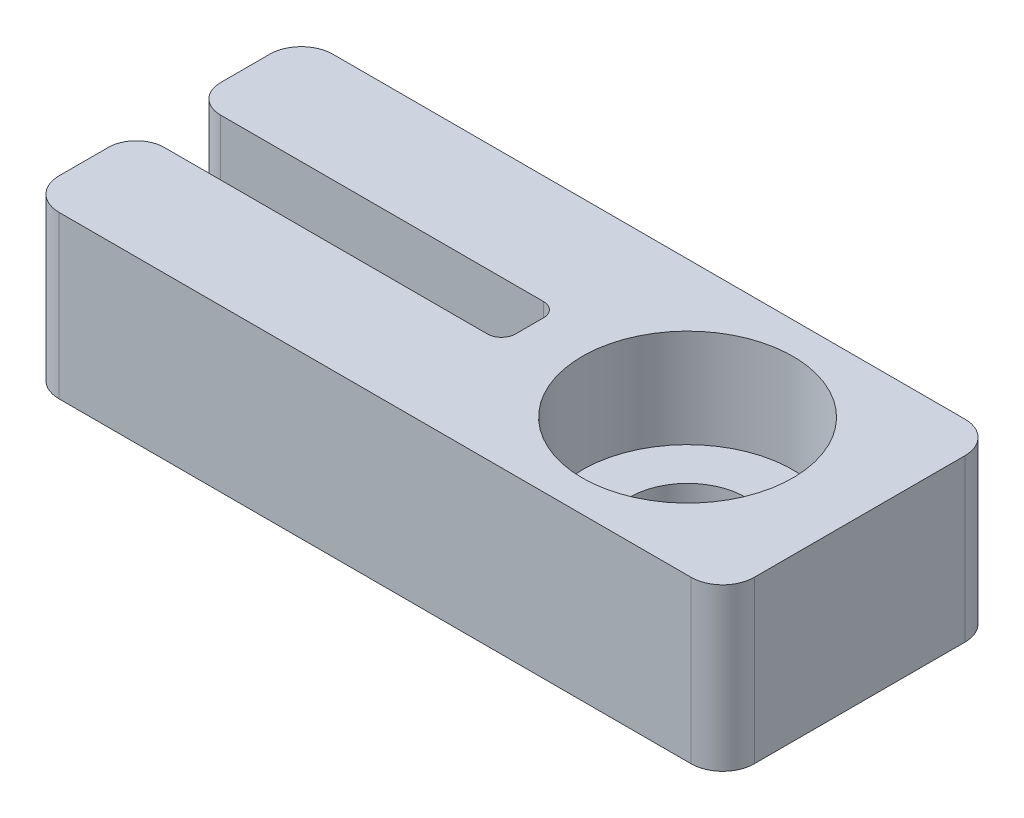
ISO-10303-21;
HEADER;
FILE_DESCRIPTION(('STEP AP214'),'2;1');
FILE_NAME('part.step','',(''),(''),'','','');
FILE_SCHEMA(('AUTOMOTIVE_DESIGN { 1 0 10303 214 1 1 1 1 }'));
ENDSEC;
DATA;
#1=APPLICATION_CONTEXT('core data for automotive mechanical design processes');
#2=APPLICATION_PROTOCOL_DEFINITION('international standard','automotive_design',2000,#1);
#3=PRODUCT_CONTEXT('',#1,'mechanical');
#4=PRODUCT('Part','Part','',(#3));
#5=PRODUCT_RELATED_PRODUCT_CATEGORY('part','',(#4));
#6=PRODUCT_DEFINITION_FORMATION('','',#4);
#7=PRODUCT_DEFINITION_CONTEXT('part definition',#1,'design');
#8=PRODUCT_DEFINITION('design','',#6,#7);
#9=PRODUCT_DEFINITION_SHAPE('','',#8);
#10=(LENGTH_UNIT() NAMED_UNIT(*) SI_UNIT(.MILLI.,.METRE.));
#11=(NAMED_UNIT(*) PLANE_ANGLE_UNIT() SI_UNIT($,.RADIAN.));
#12=(NAMED_UNIT(*) SI_UNIT($,.STERADIAN.) SOLID_ANGLE_UNIT());
#13=UNCERTAINTY_MEASURE_WITH_UNIT(LENGTH_MEASURE(1.E-05),#10,'distance_accuracy_value','');
#14=(GEOMETRIC_REPRESENTATION_CONTEXT(3) GLOBAL_UNCERTAINTY_ASSIGNED_CONTEXT((#13)) GLOBAL_UNIT_ASSIGNED_CONTEXT((#10,
#11,#12)) REPRESENTATION_CONTEXT('',''));
#15=CARTESIAN_POINT('',(0.,0.,0.));
#16=DIRECTION('',(0.,0.,1.));
#17=DIRECTION('',(1.,0.,0.));
#18=AXIS2_PLACEMENT_3D('',#15,#16,#17);
#19=CARTESIAN_POINT('',(5.,4.6,0.));
#20=DIRECTION('',(0.,-1.,0.));
#21=DIRECTION('',(0.,0.,-1.));
#22=AXIS2_PLACEMENT_3D('',#19,#20,#21);
#23=CYLINDRICAL_SURFACE('',#22,1.65);
#24=CARTESIAN_POINT('',(5.,0.,0.));
#25=DIRECTION('',(0.,1.,0.));
#26=DIRECTION('',(0.,0.,1.));
#27=AXIS2_PLACEMENT_3D('',#24,#25,#26);
#28=CIRCLE('',#27,1.65);
#29=CARTESIAN_POINT('',(5.,0.,1.65));
#30=VERTEX_POINT('',#29);
#31=EDGE_CURVE('E197',#30,#30,#28,.T.);
#32=ORIENTED_EDGE('',*,*,#31,.F.);
#33=EDGE_LOOP('',(#32));
#34=FACE_BOUND('',#33,.T.);
#35=CARTESIAN_POINT('',(5.,1.8,0.));
#36=DIRECTION('',(0.,1.,0.));
#37=DIRECTION('',(0.,0.,1.));
#38=AXIS2_PLACEMENT_3D('',#35,#36,#37);
#39=CIRCLE('',#38,1.65);
#40=CARTESIAN_POINT('',(5.,1.8,1.65));
#41=VERTEX_POINT('',#40);
#42=EDGE_CURVE('E43',#41,#41,#39,.T.);
#43=ORIENTED_EDGE('',*,*,#42,.T.);
#44=EDGE_LOOP('',(#43));
#45=FACE_BOUND('',#44,.T.);
#46=ADVANCED_FACE('F39',(#34,#45),#23,.F.);
#47=CARTESIAN_POINT('',(-9.89999999999999,4.6,2.99999999999999));
#48=DIRECTION('',(1.,0.,0.));
#49=DIRECTION('',(0.,0.,-1.));
#50=AXIS2_PLACEMENT_3D('',#47,#48,#49);
#51=PLANE('',#50);
#52=DIRECTION('',(0.,0.,1.));
#53=VECTOR('',#52,1.);
#54=CARTESIAN_POINT('',(-9.89999999999999,0.,2.99999999999999));
#55=LINE('',#54,#53);
#56=CARTESIAN_POINT('',(-9.89999999999999,0.,-2.99999999999999));
#57=VERTEX_POINT('',#56);
#58=CARTESIAN_POINT('',(-9.89999999999999,0.,-1.6));
#59=VERTEX_POINT('',#58);
#60=EDGE_CURVE('E205',#57,#59,#55,.T.);
#61=ORIENTED_EDGE('',*,*,#60,.T.);
#62=DIRECTION('',(0.,1.,0.));
#63=VECTOR('',#62,1.);
#64=CARTESIAN_POINT('',(-9.89999999999999,4.6,-1.6));
#65=LINE('',#64,#63);
#66=CARTESIAN_POINT('',(-9.89999999999999,4.6,-1.6));
#67=VERTEX_POINT('',#66);
#68=EDGE_CURVE('E48',#59,#67,#65,.T.);
#69=ORIENTED_EDGE('',*,*,#68,.T.);
#70=DIRECTION('',(0.,0.,1.));
#71=VECTOR('',#70,1.);
#72=CARTESIAN_POINT('',(-9.89999999999999,4.6,2.99999999999999));
#73=LINE('',#72,#71);
#74=CARTESIAN_POINT('',(-9.89999999999999,4.6,-2.99999999999999));
#75=VERTEX_POINT('',#74);
#76=EDGE_CURVE('E218',#75,#67,#73,.T.);
#77=ORIENTED_EDGE('',*,*,#76,.F.);
#78=DIRECTION('',(0.,-1.,0.));
#79=VECTOR('',#78,1.);
#80=CARTESIAN_POINT('',(-9.89999999999999,4.6,-2.99999999999999));
#81=LINE('',#80,#79);
#82=EDGE_CURVE('E240',#75,#57,#81,.T.);
#83=ORIENTED_EDGE('',*,*,#82,.T.);
#84=EDGE_LOOP('',(#61,#69,#77,#83));
#85=FACE_BOUND('',#84,.T.);
#86=ADVANCED_FACE('F275',(#85),#51,.F.);
#87=CARTESIAN_POINT('',(-8.99999999999999,4.6,3.));
#88=DIRECTION('',(0.,-1.,0.));
#89=DIRECTION('',(0.,0.,-1.));
#90=AXIS2_PLACEMENT_3D('',#87,#88,#89);
#91=PLANE('',#90);
#92=CARTESIAN_POINT('',(5.,4.6,0.));
#93=DIRECTION('',(0.,1.,0.));
#94=DIRECTION('',(0.,0.,1.));
#95=AXIS2_PLACEMENT_3D('',#92,#93,#94);
#96=CIRCLE('',#95,3.);
#97=CARTESIAN_POINT('',(5.,4.6,3.));
#98=VERTEX_POINT('',#97);
#99=EDGE_CURVE('E302',#98,#98,#96,.T.);
#100=ORIENTED_EDGE('',*,*,#99,.F.);
#101=EDGE_LOOP('',(#100));
#102=FACE_BOUND('',#101,.T.);
#103=DIRECTION('',(1.,0.,0.));
#104=VECTOR('',#103,1.);
#105=CARTESIAN_POINT('',(-10.1,4.6,0.8));
#106=LINE('',#105,#104);
#107=CARTESIAN_POINT('',(-9.09999999999999,4.6,0.8));
#108=VERTEX_POINT('',#107);
#109=CARTESIAN_POINT('',(0.100000000000001,4.6,0.8));
#110=VERTEX_POINT('',#109);
#111=EDGE_CURVE('E178',#108,#110,#106,.T.);
#112=ORIENTED_EDGE('',*,*,#111,.F.);
#113=CARTESIAN_POINT('',(-9.09999999999999,4.6,1.6));
#114=DIRECTION('',(0.,-1.,0.));
#115=DIRECTION('',(0.,0.,-1.));
#116=AXIS2_PLACEMENT_3D('',#113,#114,#115);
#117=CIRCLE('',#116,0.8);
#118=CARTESIAN_POINT('',(-9.89999999999999,4.6,1.6));
#119=VERTEX_POINT('',#118);
#120=EDGE_CURVE('E271',#108,#119,#117,.F.);
#121=ORIENTED_EDGE('',*,*,#120,.T.);
#122=CARTESIAN_POINT('',(-9.89999999999999,4.6,2.99999999999999));
#123=VERTEX_POINT('',#122);
#124=EDGE_CURVE('E217',#119,#123,#73,.T.);
#125=ORIENTED_EDGE('',*,*,#124,.T.);
#126=CARTESIAN_POINT('',(-8.99999999999999,4.6,3.));
#127=DIRECTION('',(0.,1.,0.));
#128=DIRECTION('',(0.,0.,-1.));
#129=AXIS2_PLACEMENT_3D('',#126,#127,#128);
#130=CIRCLE('',#129,0.9);
#131=CARTESIAN_POINT('',(-8.99999999999998,4.6,3.9));
#132=VERTEX_POINT('',#131);
#133=EDGE_CURVE('E201',#123,#132,#130,.T.);
#134=ORIENTED_EDGE('',*,*,#133,.T.);
#135=DIRECTION('',(1.,0.,0.));
#136=VECTOR('',#135,1.);
#137=CARTESIAN_POINT('',(-8.99999999999998,4.6,3.9));
#138=LINE('',#137,#136);
#139=CARTESIAN_POINT('',(9.00000000000001,4.6,3.9));
#140=VERTEX_POINT('',#139);
#141=EDGE_CURVE('E204',#132,#140,#138,.T.);
#142=ORIENTED_EDGE('',*,*,#141,.T.);
#143=CARTESIAN_POINT('',(9.00000000000002,4.6,3.));
#144=DIRECTION('',(0.,1.,0.));
#145=DIRECTION('',(0.,0.,-1.));
#146=AXIS2_PLACEMENT_3D('',#143,#144,#145);
#147=CIRCLE('',#146,0.9);
#148=CARTESIAN_POINT('',(9.90000000000002,4.6,2.99999999999999));
#149=VERTEX_POINT('',#148);
#150=EDGE_CURVE('E207',#140,#149,#147,.T.);
#151=ORIENTED_EDGE('',*,*,#150,.T.);
#152=DIRECTION('',(0.,0.,-1.));
#153=VECTOR('',#152,1.);
#154=CARTESIAN_POINT('',(9.90000000000002,4.6,2.99999999999999));
#155=LINE('',#154,#153);
#156=CARTESIAN_POINT('',(9.90000000000002,4.6,-2.99999999999999));
#157=VERTEX_POINT('',#156);
#158=EDGE_CURVE('E209',#149,#157,#155,.T.);
#159=ORIENTED_EDGE('',*,*,#158,.T.);
#160=CARTESIAN_POINT('',(9.00000000000002,4.6,-3.));
#161=DIRECTION('',(0.,1.,0.));
#162=DIRECTION('',(0.,0.,-1.));
#163=AXIS2_PLACEMENT_3D('',#160,#161,#162);
#164=CIRCLE('',#163,0.9);
#165=CARTESIAN_POINT('',(9.00000000000001,4.6,-3.9));
#166=VERTEX_POINT('',#165);
#167=EDGE_CURVE('E211',#157,#166,#164,.T.);
#168=ORIENTED_EDGE('',*,*,#167,.T.);
#169=DIRECTION('',(-1.,0.,0.));
#170=VECTOR('',#169,1.);
#171=CARTESIAN_POINT('',(-8.99999999999998,4.6,-3.9));
#172=LINE('',#171,#170);
#173=CARTESIAN_POINT('',(-8.99999999999999,4.6,-3.9));
#174=VERTEX_POINT('',#173);
#175=EDGE_CURVE('E213',#166,#174,#172,.T.);
#176=ORIENTED_EDGE('',*,*,#175,.T.);
#177=CARTESIAN_POINT('',(-8.99999999999999,4.6,-3.));
#178=DIRECTION('',(0.,1.,0.));
#179=DIRECTION('',(0.,0.,-1.));
#180=AXIS2_PLACEMENT_3D('',#177,#178,#179);
#181=CIRCLE('',#180,0.9);
#182=EDGE_CURVE('E215',#174,#75,#181,.T.);
#183=ORIENTED_EDGE('',*,*,#182,.T.);
#184=ORIENTED_EDGE('',*,*,#76,.T.);
#185=CARTESIAN_POINT('',(-9.09999999999999,4.6,-1.6));
#186=DIRECTION('',(0.,-1.,0.));
#187=DIRECTION('',(0.,0.,-1.));
#188=AXIS2_PLACEMENT_3D('',#185,#186,#187);
#189=CIRCLE('',#188,0.8);
#190=CARTESIAN_POINT('',(-9.09999999999999,4.6,-0.8));
#191=VERTEX_POINT('',#190);
#192=EDGE_CURVE('E55',#67,#191,#189,.F.);
#193=ORIENTED_EDGE('',*,*,#192,.T.);
#194=DIRECTION('',(-1.,0.,0.));
#195=VECTOR('',#194,1.);
#196=CARTESIAN_POINT('',(-10.1,4.6,-0.8));
#197=LINE('',#196,#195);
#198=CARTESIAN_POINT('',(0.100000000000001,4.6,-0.8));
#199=VERTEX_POINT('',#198);
#200=EDGE_CURVE('E180',#199,#191,#197,.T.);
#201=ORIENTED_EDGE('',*,*,#200,.F.);
#202=CARTESIAN_POINT('',(0.100000000000001,4.6,-0.4));
#203=DIRECTION('',(0.,1.,0.));
#204=DIRECTION('',(0.,0.,1.));
#205=AXIS2_PLACEMENT_3D('',#202,#203,#204);
#206=CIRCLE('',#205,0.4);
#207=CARTESIAN_POINT('',(0.500000000000001,4.6,-0.4));
#208=VERTEX_POINT('',#207);
#209=EDGE_CURVE('E290',#208,#199,#206,.T.);
#210=ORIENTED_EDGE('',*,*,#209,.F.);
#211=DIRECTION('',(0.,0.,-1.));
#212=VECTOR('',#211,1.);
#213=CARTESIAN_POINT('',(0.5,4.6,-0.4));
#214=LINE('',#213,#212);
#215=CARTESIAN_POINT('',(0.5,4.6,0.4));
#216=VERTEX_POINT('',#215);
#217=EDGE_CURVE('E169',#216,#208,#214,.T.);
#218=ORIENTED_EDGE('',*,*,#217,.F.);
#219=CARTESIAN_POINT('',(0.100000000000001,4.6,0.4));
#220=DIRECTION('',(0.,1.,0.));
#221=DIRECTION('',(0.,0.,1.));
#222=AXIS2_PLACEMENT_3D('',#219,#220,#221);
#223=CIRCLE('',#222,0.4);
#224=EDGE_CURVE('E184',#110,#216,#223,.T.);
#225=ORIENTED_EDGE('',*,*,#224,.F.);
#226=EDGE_LOOP('',(#112,#121,#125,#134,#142,#151,#159,#168,#176,#183,#184,#193,#201,#210,#218,#225));
#227=FACE_BOUND('',#226,.T.);
#228=ADVANCED_FACE('F279',(#102,#227),#91,.F.);
#229=CARTESIAN_POINT('',(-8.99999999999999,0.,3.));
#230=DIRECTION('',(0.,-1.,0.));
#231=DIRECTION('',(0.,0.,-1.));
#232=AXIS2_PLACEMENT_3D('',#229,#230,#231);
#233=PLANE('',#232);
#234=CARTESIAN_POINT('',(-9.89999999999999,0.,1.6));
#235=VERTEX_POINT('',#234);
#236=CARTESIAN_POINT('',(-9.89999999999999,0.,2.99999999999999));
#237=VERTEX_POINT('',#236);
#238=EDGE_CURVE('E235',#235,#237,#55,.T.);
#239=ORIENTED_EDGE('',*,*,#238,.F.);
#240=CARTESIAN_POINT('',(-9.09999999999999,0.,1.6));
#241=DIRECTION('',(0.,-1.,0.));
#242=DIRECTION('',(0.,0.,-1.));
#243=AXIS2_PLACEMENT_3D('',#240,#241,#242);
#244=CIRCLE('',#243,0.8);
#245=CARTESIAN_POINT('',(-9.09999999999999,0.,0.8));
#246=VERTEX_POINT('',#245);
#247=EDGE_CURVE('E266',#235,#246,#244,.T.);
#248=ORIENTED_EDGE('',*,*,#247,.T.);
#249=DIRECTION('',(1.,0.,0.));
#250=VECTOR('',#249,1.);
#251=CARTESIAN_POINT('',(-10.1,0.,0.8));
#252=LINE('',#251,#250);
#253=CARTESIAN_POINT('',(0.100000000000001,0.,0.8));
#254=VERTEX_POINT('',#253);
#255=EDGE_CURVE('E189',#246,#254,#252,.T.);
#256=ORIENTED_EDGE('',*,*,#255,.T.);
#257=CARTESIAN_POINT('',(0.100000000000001,0.,0.4));
#258=DIRECTION('',(0.,-1.,0.));
#259=DIRECTION('',(0.,0.,-1.));
#260=AXIS2_PLACEMENT_3D('',#257,#258,#259);
#261=CIRCLE('',#260,0.4);
#262=CARTESIAN_POINT('',(0.5,0.,0.4));
#263=VERTEX_POINT('',#262);
#264=EDGE_CURVE('E177',#254,#263,#261,.F.);
#265=ORIENTED_EDGE('',*,*,#264,.T.);
#266=DIRECTION('',(0.,0.,-1.));
#267=VECTOR('',#266,1.);
#268=CARTESIAN_POINT('',(0.5,0.,-0.4));
#269=LINE('',#268,#267);
#270=CARTESIAN_POINT('',(0.500000000000001,0.,-0.4));
#271=VERTEX_POINT('',#270);
#272=EDGE_CURVE('E166',#263,#271,#269,.T.);
#273=ORIENTED_EDGE('',*,*,#272,.T.);
#274=CARTESIAN_POINT('',(0.100000000000001,0.,-0.4));
#275=DIRECTION('',(0.,-1.,0.));
#276=DIRECTION('',(0.,0.,-1.));
#277=AXIS2_PLACEMENT_3D('',#274,#275,#276);
#278=CIRCLE('',#277,0.4);
#279=CARTESIAN_POINT('',(0.100000000000001,0.,-0.8));
#280=VERTEX_POINT('',#279);
#281=EDGE_CURVE('E153',#271,#280,#278,.F.);
#282=ORIENTED_EDGE('',*,*,#281,.T.);
#283=DIRECTION('',(-1.,0.,0.));
#284=VECTOR('',#283,1.);
#285=CARTESIAN_POINT('',(-10.1,0.,-0.8));
#286=LINE('',#285,#284);
#287=CARTESIAN_POINT('',(-9.09999999999999,0.,-0.8));
#288=VERTEX_POINT('',#287);
#289=EDGE_CURVE('E191',#280,#288,#286,.T.);
#290=ORIENTED_EDGE('',*,*,#289,.T.);
#291=CARTESIAN_POINT('',(-9.09999999999999,0.,-1.6));
#292=DIRECTION('',(0.,-1.,0.));
#293=DIRECTION('',(0.,0.,-1.));
#294=AXIS2_PLACEMENT_3D('',#291,#292,#293);
#295=CIRCLE('',#294,0.8);
#296=EDGE_CURVE('E264',#288,#59,#295,.T.);
#297=ORIENTED_EDGE('',*,*,#296,.T.);
#298=ORIENTED_EDGE('',*,*,#60,.F.);
#299=CARTESIAN_POINT('',(-8.99999999999999,0.,-3.));
#300=DIRECTION('',(0.,1.,0.));
#301=DIRECTION('',(0.,0.,-1.));
#302=AXIS2_PLACEMENT_3D('',#299,#300,#301);
#303=CIRCLE('',#302,0.9);
#304=CARTESIAN_POINT('',(-8.99999999999999,0.,-3.9));
#305=VERTEX_POINT('',#304);
#306=EDGE_CURVE('E233',#305,#57,#303,.T.);
#307=ORIENTED_EDGE('',*,*,#306,.F.);
#308=DIRECTION('',(-1.,0.,0.));
#309=VECTOR('',#308,1.);
#310=CARTESIAN_POINT('',(-8.99999999999998,0.,-3.9));
#311=LINE('',#310,#309);
#312=CARTESIAN_POINT('',(9.00000000000001,0.,-3.9));
#313=VERTEX_POINT('',#312);
#314=EDGE_CURVE('E231',#313,#305,#311,.T.);
#315=ORIENTED_EDGE('',*,*,#314,.F.);
#316=CARTESIAN_POINT('',(9.00000000000002,0.,-3.));
#317=DIRECTION('',(0.,1.,0.));
#318=DIRECTION('',(0.,0.,-1.));
#319=AXIS2_PLACEMENT_3D('',#316,#317,#318);
#320=CIRCLE('',#319,0.9);
#321=CARTESIAN_POINT('',(9.90000000000002,0.,-2.99999999999999));
#322=VERTEX_POINT('',#321);
#323=EDGE_CURVE('E229',#322,#313,#320,.T.);
#324=ORIENTED_EDGE('',*,*,#323,.F.);
#325=DIRECTION('',(0.,0.,-1.));
#326=VECTOR('',#325,1.);
#327=CARTESIAN_POINT('',(9.90000000000002,0.,2.99999999999999));
#328=LINE('',#327,#326);
#329=CARTESIAN_POINT('',(9.90000000000002,0.,2.99999999999999));
#330=VERTEX_POINT('',#329);
#331=EDGE_CURVE('E227',#330,#322,#328,.T.);
#332=ORIENTED_EDGE('',*,*,#331,.F.);
#333=CARTESIAN_POINT('',(9.00000000000002,0.,3.));
#334=DIRECTION('',(0.,1.,0.));
#335=DIRECTION('',(0.,0.,-1.));
#336=AXIS2_PLACEMENT_3D('',#333,#334,#335);
#337=CIRCLE('',#336,0.9);
#338=CARTESIAN_POINT('',(9.00000000000001,0.,3.9));
#339=VERTEX_POINT('',#338);
#340=EDGE_CURVE('E225',#339,#330,#337,.T.);
#341=ORIENTED_EDGE('',*,*,#340,.F.);
#342=DIRECTION('',(1.,0.,0.));
#343=VECTOR('',#342,1.);
#344=CARTESIAN_POINT('',(-8.99999999999998,0.,3.9));
#345=LINE('',#344,#343);
#346=CARTESIAN_POINT('',(-8.99999999999998,0.,3.9));
#347=VERTEX_POINT('',#346);
#348=EDGE_CURVE('E223',#347,#339,#345,.T.);
#349=ORIENTED_EDGE('',*,*,#348,.F.);
#350=CARTESIAN_POINT('',(-8.99999999999999,0.,3.));
#351=DIRECTION('',(0.,1.,0.));
#352=DIRECTION('',(0.,0.,-1.));
#353=AXIS2_PLACEMENT_3D('',#350,#351,#352);
#354=CIRCLE('',#353,0.9);
#355=EDGE_CURVE('E200',#237,#347,#354,.T.);
#356=ORIENTED_EDGE('',*,*,#355,.F.);
#357=EDGE_LOOP('',(#239,#248,#256,#265,#273,#282,#290,#297,#298,#307,#315,#324,#332,#341,#349,#356));
#358=FACE_BOUND('',#357,.T.);
#359=ORIENTED_EDGE('',*,*,#31,.T.);
#360=EDGE_LOOP('',(#359));
#361=FACE_BOUND('',#360,.T.);
#362=ADVANCED_FACE('F174',(#358,#361),#233,.T.);
#363=CARTESIAN_POINT('',(-8.99999999999999,4.6,3.));
#364=DIRECTION('',(0.,-1.,0.));
#365=DIRECTION('',(0.,0.,-1.));
#366=AXIS2_PLACEMENT_3D('',#363,#364,#365);
#367=CYLINDRICAL_SURFACE('',#366,0.9);
#368=ORIENTED_EDGE('',*,*,#355,.T.);
#369=DIRECTION('',(0.,-1.,0.));
#370=VECTOR('',#369,1.);
#371=CARTESIAN_POINT('',(-8.99999999999998,4.6,3.9));
#372=LINE('',#371,#370);
#373=EDGE_CURVE('E258',#132,#347,#372,.T.);
#374=ORIENTED_EDGE('',*,*,#373,.F.);
#375=ORIENTED_EDGE('',*,*,#133,.F.);
#376=DIRECTION('',(0.,-1.,0.));
#377=VECTOR('',#376,1.);
#378=CARTESIAN_POINT('',(-9.89999999999999,4.6,2.99999999999999));
#379=LINE('',#378,#377);
#380=EDGE_CURVE('E220',#123,#237,#379,.T.);
#381=ORIENTED_EDGE('',*,*,#380,.T.);
#382=EDGE_LOOP('',(#368,#374,#375,#381));
#383=FACE_BOUND('',#382,.T.);
#384=ADVANCED_FACE('F317',(#383),#367,.T.);
#385=CARTESIAN_POINT('',(-8.99999999999998,4.6,3.9));
#386=DIRECTION('',(0.,0.,-1.));
#387=DIRECTION('',(-1.,0.,0.));
#388=AXIS2_PLACEMENT_3D('',#385,#386,#387);
#389=PLANE('',#388);
#390=ORIENTED_EDGE('',*,*,#348,.T.);
#391=DIRECTION('',(0.,-1.,0.));
#392=VECTOR('',#391,1.);
#393=CARTESIAN_POINT('',(9.00000000000001,4.6,3.9));
#394=LINE('',#393,#392);
#395=EDGE_CURVE('E255',#140,#339,#394,.T.);
#396=ORIENTED_EDGE('',*,*,#395,.F.);
#397=ORIENTED_EDGE('',*,*,#141,.F.);
#398=ORIENTED_EDGE('',*,*,#373,.T.);
#399=EDGE_LOOP('',(#390,#396,#397,#398));
#400=FACE_BOUND('',#399,.T.);
#401=ADVANCED_FACE('F430',(#400),#389,.F.);
#402=CARTESIAN_POINT('',(9.00000000000002,4.6,3.));
#403=DIRECTION('',(0.,-1.,0.));
#404=DIRECTION('',(0.,0.,-1.));
#405=AXIS2_PLACEMENT_3D('',#402,#403,#404);
#406=CYLINDRICAL_SURFACE('',#405,0.9);
#407=ORIENTED_EDGE('',*,*,#340,.T.);
#408=DIRECTION('',(0.,-1.,0.));
#409=VECTOR('',#408,1.);
#410=CARTESIAN_POINT('',(9.90000000000002,4.6,2.99999999999999));
#411=LINE('',#410,#409);
#412=EDGE_CURVE('E252',#149,#330,#411,.T.);
#413=ORIENTED_EDGE('',*,*,#412,.F.);
#414=ORIENTED_EDGE('',*,*,#150,.F.);
#415=ORIENTED_EDGE('',*,*,#395,.T.);
#416=EDGE_LOOP('',(#407,#413,#414,#415));
#417=FACE_BOUND('',#416,.T.);
#418=ADVANCED_FACE('F422',(#417),#406,.T.);
#419=CARTESIAN_POINT('',(9.90000000000002,4.6,2.99999999999999));
#420=DIRECTION('',(-1.,0.,0.));
#421=DIRECTION('',(0.,0.,1.));
#422=AXIS2_PLACEMENT_3D('',#419,#420,#421);
#423=PLANE('',#422);
#424=ORIENTED_EDGE('',*,*,#331,.T.);
#425=DIRECTION('',(0.,-1.,0.));
#426=VECTOR('',#425,1.);
#427=CARTESIAN_POINT('',(9.90000000000002,4.6,-2.99999999999999));
#428=LINE('',#427,#426);
#429=EDGE_CURVE('E249',#157,#322,#428,.T.);
#430=ORIENTED_EDGE('',*,*,#429,.F.);
#431=ORIENTED_EDGE('',*,*,#158,.F.);
#432=ORIENTED_EDGE('',*,*,#412,.T.);
#433=EDGE_LOOP('',(#424,#430,#431,#432));
#434=FACE_BOUND('',#433,.T.);
#435=ADVANCED_FACE('F414',(#434),#423,.F.);
#436=CARTESIAN_POINT('',(9.00000000000002,4.6,-3.));
#437=DIRECTION('',(0.,-1.,0.));
#438=DIRECTION('',(0.,0.,-1.));
#439=AXIS2_PLACEMENT_3D('',#436,#437,#438);
#440=CYLINDRICAL_SURFACE('',#439,0.9);
#441=ORIENTED_EDGE('',*,*,#323,.T.);
#442=DIRECTION('',(0.,-1.,0.));
#443=VECTOR('',#442,1.);
#444=CARTESIAN_POINT('',(9.00000000000001,4.6,-3.9));
#445=LINE('',#444,#443);
#446=EDGE_CURVE('E246',#166,#313,#445,.T.);
#447=ORIENTED_EDGE('',*,*,#446,.F.);
#448=ORIENTED_EDGE('',*,*,#167,.F.);
#449=ORIENTED_EDGE('',*,*,#429,.T.);
#450=EDGE_LOOP('',(#441,#447,#448,#449));
#451=FACE_BOUND('',#450,.T.);
#452=ADVANCED_FACE('F406',(#451),#440,.T.);
#453=CARTESIAN_POINT('',(-8.99999999999998,4.6,-3.9));
#454=DIRECTION('',(0.,0.,1.));
#455=DIRECTION('',(1.,0.,0.));
#456=AXIS2_PLACEMENT_3D('',#453,#454,#455);
#457=PLANE('',#456);
#458=ORIENTED_EDGE('',*,*,#314,.T.);
#459=DIRECTION('',(0.,-1.,0.));
#460=VECTOR('',#459,1.);
#461=CARTESIAN_POINT('',(-8.99999999999999,4.6,-3.9));
#462=LINE('',#461,#460);
#463=EDGE_CURVE('E243',#174,#305,#462,.T.);
#464=ORIENTED_EDGE('',*,*,#463,.F.);
#465=ORIENTED_EDGE('',*,*,#175,.F.);
#466=ORIENTED_EDGE('',*,*,#446,.T.);
#467=EDGE_LOOP('',(#458,#464,#465,#466));
#468=FACE_BOUND('',#467,.T.);
#469=ADVANCED_FACE('F399',(#468),#457,.F.);
#470=CARTESIAN_POINT('',(-8.99999999999999,4.6,-3.));
#471=DIRECTION('',(0.,-1.,0.));
#472=DIRECTION('',(0.,0.,-1.));
#473=AXIS2_PLACEMENT_3D('',#470,#471,#472);
#474=CYLINDRICAL_SURFACE('',#473,0.9);
#475=ORIENTED_EDGE('',*,*,#306,.T.);
#476=ORIENTED_EDGE('',*,*,#82,.F.);
#477=ORIENTED_EDGE('',*,*,#182,.F.);
#478=ORIENTED_EDGE('',*,*,#463,.T.);
#479=EDGE_LOOP('',(#475,#476,#477,#478));
#480=FACE_BOUND('',#479,.T.);
#481=ADVANCED_FACE('F285',(#480),#474,.T.);
#482=ORIENTED_EDGE('',*,*,#124,.F.);
#483=DIRECTION('',(0.,-1.,0.));
#484=VECTOR('',#483,1.);
#485=CARTESIAN_POINT('',(-9.89999999999999,4.6,1.6));
#486=LINE('',#485,#484);
#487=EDGE_CURVE('E261',#119,#235,#486,.T.);
#488=ORIENTED_EDGE('',*,*,#487,.T.);
#489=ORIENTED_EDGE('',*,*,#238,.T.);
#490=ORIENTED_EDGE('',*,*,#380,.F.);
#491=EDGE_LOOP('',(#482,#488,#489,#490));
#492=FACE_BOUND('',#491,.T.);
#493=ADVANCED_FACE('F320',(#492),#51,.F.);
#494=CARTESIAN_POINT('',(-10.1,-11.1157545852722,-0.8));
#495=DIRECTION('',(0.,0.,-1.));
#496=DIRECTION('',(-1.,0.,0.));
#497=AXIS2_PLACEMENT_3D('',#494,#495,#496);
#498=PLANE('',#497);
#499=ORIENTED_EDGE('',*,*,#200,.T.);
#500=DIRECTION('',(0.,1.,0.));
#501=VECTOR('',#500,1.);
#502=CARTESIAN_POINT('',(-9.09999999999999,-11.1157545852722,-0.8));
#503=LINE('',#502,#501);
#504=EDGE_CURVE('E11',#191,#288,#503,.F.);
#505=ORIENTED_EDGE('',*,*,#504,.T.);
#506=ORIENTED_EDGE('',*,*,#289,.F.);
#507=DIRECTION('',(0.,1.,0.));
#508=VECTOR('',#507,1.);
#509=CARTESIAN_POINT('',(0.100000000000001,-11.1157545852722,-0.8));
#510=LINE('',#509,#508);
#511=EDGE_CURVE('E159',#280,#199,#510,.T.);
#512=ORIENTED_EDGE('',*,*,#511,.T.);
#513=EDGE_LOOP('',(#499,#505,#506,#512));
#514=FACE_BOUND('',#513,.T.);
#515=ADVANCED_FACE('F289',(#514),#498,.F.);
#516=CARTESIAN_POINT('',(-10.1,-11.1157545852722,0.8));
#517=DIRECTION('',(0.,0.,1.));
#518=DIRECTION('',(1.,0.,0.));
#519=AXIS2_PLACEMENT_3D('',#516,#517,#518);
#520=PLANE('',#519);
#521=ORIENTED_EDGE('',*,*,#255,.F.);
#522=DIRECTION('',(0.,-1.,0.));
#523=VECTOR('',#522,1.);
#524=CARTESIAN_POINT('',(-9.09999999999999,-11.1157545852722,0.8));
#525=LINE('',#524,#523);
#526=EDGE_CURVE('E268',#246,#108,#525,.F.);
#527=ORIENTED_EDGE('',*,*,#526,.T.);
#528=ORIENTED_EDGE('',*,*,#111,.T.);
#529=DIRECTION('',(0.,1.,0.));
#530=VECTOR('',#529,1.);
#531=CARTESIAN_POINT('',(0.100000000000001,-11.1157545852722,0.8));
#532=LINE('',#531,#530);
#533=EDGE_CURVE('E188',#254,#110,#532,.T.);
#534=ORIENTED_EDGE('',*,*,#533,.F.);
#535=EDGE_LOOP('',(#521,#527,#528,#534));
#536=FACE_BOUND('',#535,.T.);
#537=ADVANCED_FACE('F330',(#536),#520,.F.);
#538=CARTESIAN_POINT('',(0.5,-11.1157545852722,-0.4));
#539=DIRECTION('',(1.,0.,0.));
#540=DIRECTION('',(0.,0.,-1.));
#541=AXIS2_PLACEMENT_3D('',#538,#539,#540);
#542=PLANE('',#541);
#543=DIRECTION('',(0.,1.,0.));
#544=VECTOR('',#543,1.);
#545=CARTESIAN_POINT('',(0.5,-11.1157545852722,0.4));
#546=LINE('',#545,#544);
#547=EDGE_CURVE('E187',#263,#216,#546,.T.);
#548=ORIENTED_EDGE('',*,*,#547,.T.);
#549=ORIENTED_EDGE('',*,*,#217,.T.);
#550=DIRECTION('',(0.,1.,0.));
#551=VECTOR('',#550,1.);
#552=CARTESIAN_POINT('',(0.500000000000001,-11.1157545852722,-0.4));
#553=LINE('',#552,#551);
#554=EDGE_CURVE('E157',#271,#208,#553,.T.);
#555=ORIENTED_EDGE('',*,*,#554,.F.);
#556=ORIENTED_EDGE('',*,*,#272,.F.);
#557=EDGE_LOOP('',(#548,#549,#555,#556));
#558=FACE_BOUND('',#557,.T.);
#559=ADVANCED_FACE('F165',(#558),#542,.F.);
#560=CARTESIAN_POINT('',(0.100000000000001,-11.1157545852722,-0.4));
#561=DIRECTION('',(0.,1.,0.));
#562=DIRECTION('',(0.,0.,1.));
#563=AXIS2_PLACEMENT_3D('',#560,#561,#562);
#564=CYLINDRICAL_SURFACE('',#563,0.4);
#565=ORIENTED_EDGE('',*,*,#554,.T.);
#566=ORIENTED_EDGE('',*,*,#209,.T.);
#567=ORIENTED_EDGE('',*,*,#511,.F.);
#568=ORIENTED_EDGE('',*,*,#281,.F.);
#569=EDGE_LOOP('',(#565,#566,#567,#568));
#570=FACE_BOUND('',#569,.T.);
#571=ADVANCED_FACE('F155',(#570),#564,.F.);
#572=CARTESIAN_POINT('',(0.100000000000001,-11.1157545852722,0.4));
#573=DIRECTION('',(0.,1.,0.));
#574=DIRECTION('',(0.,0.,1.));
#575=AXIS2_PLACEMENT_3D('',#572,#573,#574);
#576=CYLINDRICAL_SURFACE('',#575,0.4);
#577=ORIENTED_EDGE('',*,*,#533,.T.);
#578=ORIENTED_EDGE('',*,*,#224,.T.);
#579=ORIENTED_EDGE('',*,*,#547,.F.);
#580=ORIENTED_EDGE('',*,*,#264,.F.);
#581=EDGE_LOOP('',(#577,#578,#579,#580));
#582=FACE_BOUND('',#581,.T.);
#583=ADVANCED_FACE('F333',(#582),#576,.F.);
#584=CARTESIAN_POINT('',(-9.09999999999999,4.6,1.6));
#585=DIRECTION('',(0.,-1.,0.));
#586=DIRECTION('',(0.,0.,-1.));
#587=AXIS2_PLACEMENT_3D('',#584,#585,#586);
#588=CYLINDRICAL_SURFACE('',#587,0.8);
#589=ORIENTED_EDGE('',*,*,#120,.F.);
#590=ORIENTED_EDGE('',*,*,#526,.F.);
#591=ORIENTED_EDGE('',*,*,#247,.F.);
#592=ORIENTED_EDGE('',*,*,#487,.F.);
#593=EDGE_LOOP('',(#589,#590,#591,#592));
#594=FACE_BOUND('',#593,.T.);
#595=ADVANCED_FACE('F341',(#594),#588,.T.);
#596=CARTESIAN_POINT('',(-9.09999999999999,4.6,-1.6));
#597=DIRECTION('',(0.,1.,0.));
#598=DIRECTION('',(0.,0.,1.));
#599=AXIS2_PLACEMENT_3D('',#596,#597,#598);
#600=CYLINDRICAL_SURFACE('',#599,0.8);
#601=ORIENTED_EDGE('',*,*,#296,.F.);
#602=ORIENTED_EDGE('',*,*,#504,.F.);
#603=ORIENTED_EDGE('',*,*,#192,.F.);
#604=ORIENTED_EDGE('',*,*,#68,.F.);
#605=EDGE_LOOP('',(#601,#602,#603,#604));
#606=FACE_BOUND('',#605,.T.);
#607=ADVANCED_FACE('F41',(#606),#600,.T.);
#608=CARTESIAN_POINT('',(5.,1.8,0.));
#609=DIRECTION('',(0.,1.,0.));
#610=DIRECTION('',(0.,0.,1.));
#611=AXIS2_PLACEMENT_3D('',#608,#609,#610);
#612=CYLINDRICAL_SURFACE('',#611,3.);
#613=CARTESIAN_POINT('',(5.,1.8,0.));
#614=DIRECTION('',(0.,1.,0.));
#615=DIRECTION('',(0.,0.,1.));
#616=AXIS2_PLACEMENT_3D('',#613,#614,#615);
#617=CIRCLE('',#616,3.);
#618=CARTESIAN_POINT('',(5.,1.8,3.));
#619=VERTEX_POINT('',#618);
#620=EDGE_CURVE('E298',#619,#619,#617,.T.);
#621=ORIENTED_EDGE('',*,*,#620,.F.);
#622=EDGE_LOOP('',(#621));
#623=FACE_BOUND('',#622,.T.);
#624=ORIENTED_EDGE('',*,*,#99,.T.);
#625=EDGE_LOOP('',(#624));
#626=FACE_BOUND('',#625,.T.);
#627=ADVANCED_FACE('F309',(#623,#626),#612,.F.);
#628=CARTESIAN_POINT('',(5.,1.8,0.));
#629=DIRECTION('',(0.,1.,0.));
#630=DIRECTION('',(0.,0.,1.));
#631=AXIS2_PLACEMENT_3D('',#628,#629,#630);
#632=PLANE('',#631);
#633=ORIENTED_EDGE('',*,*,#42,.F.);
#634=EDGE_LOOP('',(#633));
#635=FACE_BOUND('',#634,.T.);
#636=ORIENTED_EDGE('',*,*,#620,.T.);
#637=EDGE_LOOP('',(#636));
#638=FACE_BOUND('',#637,.T.);
#639=ADVANCED_FACE('F344',(#635,#638),#632,.T.);
#640=CLOSED_SHELL('',(#46,#86,#228,#362,#384,#401,#418,#435,#452,#469,#481,#493,#515,#537,#559,
#571,#583,#595,#607,#627,#639));
#641=MANIFOLD_SOLID_BREP('B2',#640);
#642=ADVANCED_BREP_SHAPE_REPRESENTATION('',(#18,#641),#14);
#643=SHAPE_DEFINITION_REPRESENTATION(#9,#642);
ENDSEC;
END-ISO-10303-21;
